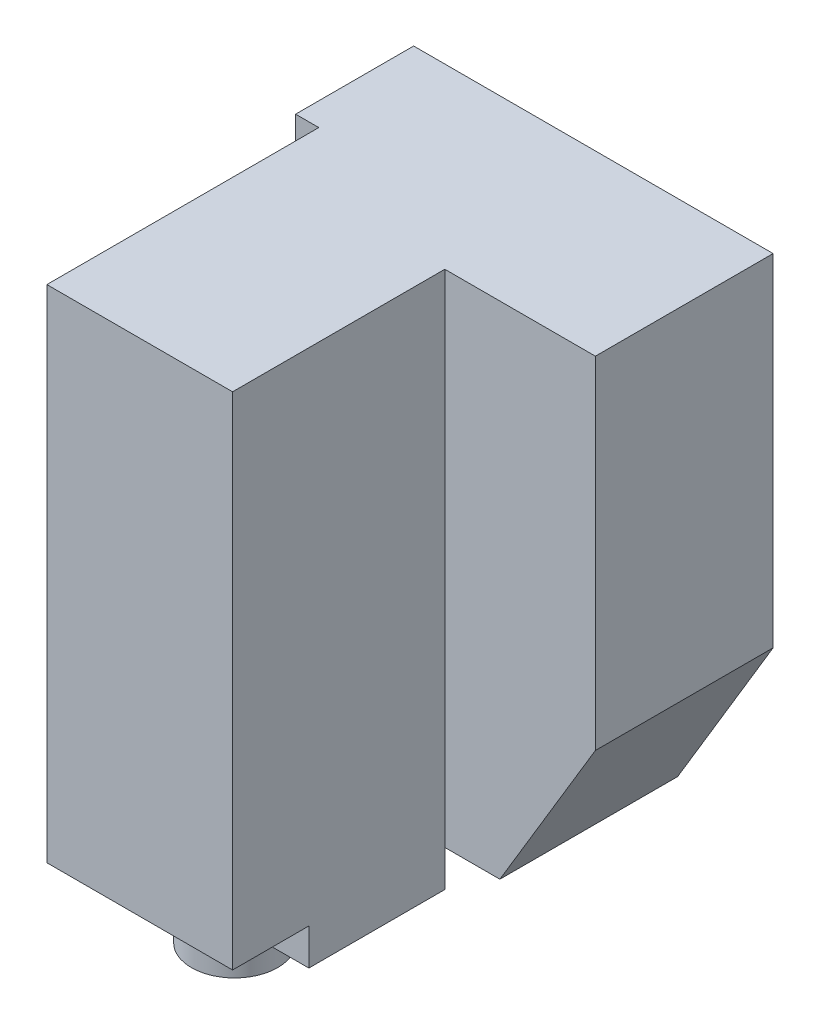
ISO-10303-21;
HEADER;
FILE_DESCRIPTION(('STEP AP214'),'2;1');
FILE_NAME('part.step','',(''),(''),'','','');
FILE_SCHEMA(('AUTOMOTIVE_DESIGN { 1 0 10303 214 1 1 1 1 }'));
ENDSEC;
DATA;
#1=APPLICATION_CONTEXT('core data for automotive mechanical design processes');
#2=APPLICATION_PROTOCOL_DEFINITION('international standard','automotive_design',2000,#1);
#3=PRODUCT_CONTEXT('',#1,'mechanical');
#4=PRODUCT('Part','Part','',(#3));
#5=PRODUCT_RELATED_PRODUCT_CATEGORY('part','',(#4));
#6=PRODUCT_DEFINITION_FORMATION('','',#4);
#7=PRODUCT_DEFINITION_CONTEXT('part definition',#1,'design');
#8=PRODUCT_DEFINITION('design','',#6,#7);
#9=PRODUCT_DEFINITION_SHAPE('','',#8);
#10=(LENGTH_UNIT() NAMED_UNIT(*) SI_UNIT(.MILLI.,.METRE.));
#11=(NAMED_UNIT(*) PLANE_ANGLE_UNIT() SI_UNIT($,.RADIAN.));
#12=(NAMED_UNIT(*) SI_UNIT($,.STERADIAN.) SOLID_ANGLE_UNIT());
#13=UNCERTAINTY_MEASURE_WITH_UNIT(LENGTH_MEASURE(1.E-05),#10,'distance_accuracy_value','');
#14=(GEOMETRIC_REPRESENTATION_CONTEXT(3) GLOBAL_UNCERTAINTY_ASSIGNED_CONTEXT((#13)) GLOBAL_UNIT_ASSIGNED_CONTEXT((#10,
#11,#12)) REPRESENTATION_CONTEXT('',''));
#15=CARTESIAN_POINT('',(0.,0.,0.));
#16=DIRECTION('',(0.,0.,1.));
#17=DIRECTION('',(1.,0.,0.));
#18=AXIS2_PLACEMENT_3D('',#15,#16,#17);
#19=CARTESIAN_POINT('',(-280.,0.,588.));
#20=DIRECTION('',(0.,1.,0.));
#21=DIRECTION('',(0.,0.,1.));
#22=AXIS2_PLACEMENT_3D('',#19,#20,#21);
#23=PLANE('',#22);
#24=CARTESIAN_POINT('',(-160.,0.,425.));
#25=DIRECTION('',(0.,1.,0.));
#26=DIRECTION('',(0.,0.,1.));
#27=AXIS2_PLACEMENT_3D('',#24,#25,#26);
#28=CIRCLE('',#27,81.);
#29=CARTESIAN_POINT('',(-160.,0.,506.));
#30=VERTEX_POINT('',#29);
#31=EDGE_CURVE('E45',#30,#30,#28,.F.);
#32=ORIENTED_EDGE('',*,*,#31,.F.);
#33=EDGE_LOOP('',(#32));
#34=FACE_BOUND('',#33,.T.);
#35=DIRECTION('',(1.,0.,0.));
#36=VECTOR('',#35,1.);
#37=CARTESIAN_POINT('',(-55.,0.,268.));
#38=LINE('',#37,#36);
#39=CARTESIAN_POINT('',(-55.,0.,268.));
#40=VERTEX_POINT('',#39);
#41=CARTESIAN_POINT('',(0.,0.,268.));
#42=VERTEX_POINT('',#41);
#43=EDGE_CURVE('E58',#40,#42,#38,.T.);
#44=ORIENTED_EDGE('',*,*,#43,.F.);
#45=DIRECTION('',(0.,0.,-1.));
#46=VECTOR('',#45,1.);
#47=CARTESIAN_POINT('',(-55.,0.,473.));
#48=LINE('',#47,#46);
#49=CARTESIAN_POINT('',(-55.,0.,473.));
#50=VERTEX_POINT('',#49);
#51=EDGE_CURVE('E169',#50,#40,#48,.T.);
#52=ORIENTED_EDGE('',*,*,#51,.F.);
#53=DIRECTION('',(-1.,0.,0.));
#54=VECTOR('',#53,1.);
#55=CARTESIAN_POINT('',(-55.,0.,473.));
#56=LINE('',#55,#54);
#57=CARTESIAN_POINT('',(0.,0.,473.));
#58=VERTEX_POINT('',#57);
#59=EDGE_CURVE('E64',#58,#50,#56,.T.);
#60=ORIENTED_EDGE('',*,*,#59,.F.);
#61=DIRECTION('',(0.,0.,-1.));
#62=VECTOR('',#61,1.);
#63=CARTESIAN_POINT('',(0.,0.,588.));
#64=LINE('',#63,#62);
#65=CARTESIAN_POINT('',(0.,0.,588.));
#66=VERTEX_POINT('',#65);
#67=EDGE_CURVE('E260',#66,#58,#64,.T.);
#68=ORIENTED_EDGE('',*,*,#67,.F.);
#69=DIRECTION('',(1.,0.,0.));
#70=VECTOR('',#69,1.);
#71=CARTESIAN_POINT('',(-280.,0.,588.));
#72=LINE('',#71,#70);
#73=CARTESIAN_POINT('',(-280.,0.,588.));
#74=VERTEX_POINT('',#73);
#75=EDGE_CURVE('E251',#74,#66,#72,.T.);
#76=ORIENTED_EDGE('',*,*,#75,.F.);
#77=DIRECTION('',(0.,0.,-1.));
#78=VECTOR('',#77,1.);
#79=CARTESIAN_POINT('',(-280.,0.,588.));
#80=LINE('',#79,#78);
#81=CARTESIAN_POINT('',(-280.,0.,178.));
#82=VERTEX_POINT('',#81);
#83=EDGE_CURVE('E262',#74,#82,#80,.T.);
#84=ORIENTED_EDGE('',*,*,#83,.T.);
#85=DIRECTION('',(1.,0.,0.));
#86=VECTOR('',#85,1.);
#87=CARTESIAN_POINT('',(0.,0.,178.));
#88=LINE('',#87,#86);
#89=CARTESIAN_POINT('',(0.,0.,178.));
#90=VERTEX_POINT('',#89);
#91=EDGE_CURVE('E170',#82,#90,#88,.T.);
#92=ORIENTED_EDGE('',*,*,#91,.T.);
#93=DIRECTION('',(0.,0.,1.));
#94=VECTOR('',#93,1.);
#95=CARTESIAN_POINT('',(0.,0.,-883.091161772102));
#96=LINE('',#95,#94);
#97=CARTESIAN_POINT('',(0.,0.,0.));
#98=VERTEX_POINT('',#97);
#99=EDGE_CURVE('E182',#98,#90,#96,.T.);
#100=ORIENTED_EDGE('',*,*,#99,.F.);
#101=DIRECTION('',(1.,0.,0.));
#102=VECTOR('',#101,1.);
#103=CARTESIAN_POINT('',(-280.,0.,0.));
#104=LINE('',#103,#102);
#105=CARTESIAN_POINT('',(83.,0.,0.));
#106=VERTEX_POINT('',#105);
#107=EDGE_CURVE('E249',#98,#106,#104,.T.);
#108=ORIENTED_EDGE('',*,*,#107,.T.);
#109=DIRECTION('',(0.,0.,1.));
#110=VECTOR('',#109,1.);
#111=CARTESIAN_POINT('',(83.,0.,-788.38696082571));
#112=LINE('',#111,#110);
#113=CARTESIAN_POINT('',(83.,0.,268.));
#114=VERTEX_POINT('',#113);
#115=EDGE_CURVE('E213',#106,#114,#112,.T.);
#116=ORIENTED_EDGE('',*,*,#115,.T.);
#117=DIRECTION('',(1.,0.,0.));
#118=VECTOR('',#117,1.);
#119=CARTESIAN_POINT('',(0.,0.,268.));
#120=LINE('',#119,#118);
#121=EDGE_CURVE('E224',#42,#114,#120,.T.);
#122=ORIENTED_EDGE('',*,*,#121,.F.);
#123=EDGE_LOOP('',(#44,#52,#60,#68,#76,#84,#92,#100,#108,#116,#122));
#124=FACE_BOUND('',#123,.T.);
#125=ADVANCED_FACE('F41',(#34,#124),#23,.F.);
#126=CARTESIAN_POINT('',(0.,0.,588.));
#127=DIRECTION('',(-1.,0.,0.));
#128=DIRECTION('',(0.,0.,1.));
#129=AXIS2_PLACEMENT_3D('',#126,#127,#128);
#130=PLANE('',#129);
#131=DIRECTION('',(0.,-1.,0.));
#132=VECTOR('',#131,1.);
#133=CARTESIAN_POINT('',(0.,755.,268.));
#134=LINE('',#133,#132);
#135=CARTESIAN_POINT('',(0.,755.,268.));
#136=VERTEX_POINT('',#135);
#137=EDGE_CURVE('E222',#136,#42,#134,.T.);
#138=ORIENTED_EDGE('',*,*,#137,.F.);
#139=DIRECTION('',(0.,0.,-1.));
#140=VECTOR('',#139,1.);
#141=CARTESIAN_POINT('',(0.,755.,588.));
#142=LINE('',#141,#140);
#143=CARTESIAN_POINT('',(0.,755.,588.));
#144=VERTEX_POINT('',#143);
#145=EDGE_CURVE('E255',#144,#136,#142,.T.);
#146=ORIENTED_EDGE('',*,*,#145,.F.);
#147=DIRECTION('',(0.,1.,0.));
#148=VECTOR('',#147,1.);
#149=CARTESIAN_POINT('',(0.,0.,588.));
#150=LINE('',#149,#148);
#151=EDGE_CURVE('E253',#66,#144,#150,.T.);
#152=ORIENTED_EDGE('',*,*,#151,.F.);
#153=ORIENTED_EDGE('',*,*,#67,.T.);
#154=DIRECTION('',(0.,1.,0.));
#155=VECTOR('',#154,1.);
#156=CARTESIAN_POINT('',(0.,-55.,473.));
#157=LINE('',#156,#155);
#158=CARTESIAN_POINT('',(0.,-55.,473.));
#159=VERTEX_POINT('',#158);
#160=EDGE_CURVE('E174',#159,#58,#157,.T.);
#161=ORIENTED_EDGE('',*,*,#160,.F.);
#162=DIRECTION('',(0.,0.,1.));
#163=VECTOR('',#162,1.);
#164=CARTESIAN_POINT('',(0.,-55.,473.));
#165=LINE('',#164,#163);
#166=CARTESIAN_POINT('',(0.,-55.,268.));
#167=VERTEX_POINT('',#166);
#168=EDGE_CURVE('E157',#167,#159,#165,.T.);
#169=ORIENTED_EDGE('',*,*,#168,.F.);
#170=DIRECTION('',(0.,1.,0.));
#171=VECTOR('',#170,1.);
#172=CARTESIAN_POINT('',(0.,-55.,268.));
#173=LINE('',#172,#171);
#174=EDGE_CURVE('E154',#167,#42,#173,.T.);
#175=ORIENTED_EDGE('',*,*,#174,.T.);
#176=EDGE_LOOP('',(#138,#146,#152,#153,#161,#169,#175));
#177=FACE_BOUND('',#176,.T.);
#178=ADVANCED_FACE('F273',(#177),#130,.F.);
#179=CARTESIAN_POINT('',(-280.,755.,588.));
#180=DIRECTION('',(0.,-1.,0.));
#181=DIRECTION('',(0.,0.,-1.));
#182=AXIS2_PLACEMENT_3D('',#179,#180,#181);
#183=PLANE('',#182);
#184=DIRECTION('',(-1.,0.,0.));
#185=VECTOR('',#184,1.);
#186=CARTESIAN_POINT('',(-280.,755.,0.));
#187=LINE('',#186,#185);
#188=CARTESIAN_POINT('',(227.,755.,0.));
#189=VERTEX_POINT('',#188);
#190=CARTESIAN_POINT('',(-315.,755.,0.));
#191=VERTEX_POINT('',#190);
#192=EDGE_CURVE('E244',#189,#191,#187,.T.);
#193=ORIENTED_EDGE('',*,*,#192,.T.);
#194=DIRECTION('',(0.,0.,1.));
#195=VECTOR('',#194,1.);
#196=CARTESIAN_POINT('',(-315.,755.,-883.091161772102));
#197=LINE('',#196,#195);
#198=CARTESIAN_POINT('',(-315.,755.,178.));
#199=VERTEX_POINT('',#198);
#200=EDGE_CURVE('E201',#191,#199,#197,.T.);
#201=ORIENTED_EDGE('',*,*,#200,.T.);
#202=DIRECTION('',(1.,0.,0.));
#203=VECTOR('',#202,1.);
#204=CARTESIAN_POINT('',(0.,755.,178.));
#205=LINE('',#204,#203);
#206=CARTESIAN_POINT('',(-280.,755.,178.));
#207=VERTEX_POINT('',#206);
#208=EDGE_CURVE('E189',#199,#207,#205,.T.);
#209=ORIENTED_EDGE('',*,*,#208,.T.);
#210=DIRECTION('',(0.,0.,-1.));
#211=VECTOR('',#210,1.);
#212=CARTESIAN_POINT('',(-280.,755.,588.));
#213=LINE('',#212,#211);
#214=CARTESIAN_POINT('',(-280.,755.,588.));
#215=VERTEX_POINT('',#214);
#216=EDGE_CURVE('E264',#215,#207,#213,.T.);
#217=ORIENTED_EDGE('',*,*,#216,.F.);
#218=DIRECTION('',(-1.,0.,0.));
#219=VECTOR('',#218,1.);
#220=CARTESIAN_POINT('',(-280.,755.,588.));
#221=LINE('',#220,#219);
#222=EDGE_CURVE('E245',#144,#215,#221,.T.);
#223=ORIENTED_EDGE('',*,*,#222,.F.);
#224=ORIENTED_EDGE('',*,*,#145,.T.);
#225=DIRECTION('',(-1.,0.,0.));
#226=VECTOR('',#225,1.);
#227=CARTESIAN_POINT('',(227.,755.,268.));
#228=LINE('',#227,#226);
#229=CARTESIAN_POINT('',(227.,755.,268.));
#230=VERTEX_POINT('',#229);
#231=EDGE_CURVE('E219',#230,#136,#228,.T.);
#232=ORIENTED_EDGE('',*,*,#231,.F.);
#233=DIRECTION('',(0.,0.,1.));
#234=VECTOR('',#233,1.);
#235=CARTESIAN_POINT('',(227.,755.,-788.38696082571));
#236=LINE('',#235,#234);
#237=EDGE_CURVE('E229',#189,#230,#236,.T.);
#238=ORIENTED_EDGE('',*,*,#237,.F.);
#239=EDGE_LOOP('',(#193,#201,#209,#217,#223,#224,#232,#238));
#240=FACE_BOUND('',#239,.T.);
#241=ADVANCED_FACE('F43',(#240),#183,.F.);
#242=CARTESIAN_POINT('',(-280.,755.,588.));
#243=DIRECTION('',(1.,0.,0.));
#244=DIRECTION('',(0.,1.,0.));
#245=AXIS2_PLACEMENT_3D('',#242,#243,#244);
#246=PLANE('',#245);
#247=ORIENTED_EDGE('',*,*,#216,.T.);
#248=DIRECTION('',(0.,-1.,0.));
#249=VECTOR('',#248,1.);
#250=CARTESIAN_POINT('',(-280.,0.,178.));
#251=LINE('',#250,#249);
#252=EDGE_CURVE('E172',#207,#82,#251,.T.);
#253=ORIENTED_EDGE('',*,*,#252,.T.);
#254=ORIENTED_EDGE('',*,*,#83,.F.);
#255=DIRECTION('',(0.,-1.,0.));
#256=VECTOR('',#255,1.);
#257=CARTESIAN_POINT('',(-280.,755.,588.));
#258=LINE('',#257,#256);
#259=EDGE_CURVE('E248',#215,#74,#258,.T.);
#260=ORIENTED_EDGE('',*,*,#259,.F.);
#261=EDGE_LOOP('',(#247,#253,#254,#260));
#262=FACE_BOUND('',#261,.T.);
#263=ADVANCED_FACE('F282',(#262),#246,.F.);
#264=CARTESIAN_POINT('',(0.,0.,588.));
#265=DIRECTION('',(0.,0.,1.));
#266=DIRECTION('',(1.,0.,0.));
#267=AXIS2_PLACEMENT_3D('',#264,#265,#266);
#268=PLANE('',#267);
#269=ORIENTED_EDGE('',*,*,#222,.T.);
#270=ORIENTED_EDGE('',*,*,#259,.T.);
#271=ORIENTED_EDGE('',*,*,#75,.T.);
#272=ORIENTED_EDGE('',*,*,#151,.T.);
#273=EDGE_LOOP('',(#269,#270,#271,#272));
#274=FACE_BOUND('',#273,.T.);
#275=ADVANCED_FACE('F284',(#274),#268,.T.);
#276=CARTESIAN_POINT('',(0.,0.,0.));
#277=DIRECTION('',(0.,0.,1.));
#278=DIRECTION('',(1.,0.,0.));
#279=AXIS2_PLACEMENT_3D('',#276,#277,#278);
#280=PLANE('',#279);
#281=ORIENTED_EDGE('',*,*,#192,.F.);
#282=DIRECTION('',(0.,-1.,0.));
#283=VECTOR('',#282,1.);
#284=CARTESIAN_POINT('',(227.,240.133296316858,0.));
#285=LINE('',#284,#283);
#286=CARTESIAN_POINT('',(227.,240.133296316858,0.));
#287=VERTEX_POINT('',#286);
#288=EDGE_CURVE('E212',#189,#287,#285,.T.);
#289=ORIENTED_EDGE('',*,*,#288,.T.);
#290=DIRECTION('',(-0.514285714285714,-0.857618915417351,0.));
#291=VECTOR('',#290,1.);
#292=CARTESIAN_POINT('',(83.,0.,0.));
#293=LINE('',#292,#291);
#294=EDGE_CURVE('E209',#287,#106,#293,.T.);
#295=ORIENTED_EDGE('',*,*,#294,.T.);
#296=ORIENTED_EDGE('',*,*,#107,.F.);
#297=DIRECTION('',(0.,1.,0.));
#298=VECTOR('',#297,1.);
#299=CARTESIAN_POINT('',(0.,0.,0.));
#300=LINE('',#299,#298);
#301=CARTESIAN_POINT('',(0.,-70.,0.));
#302=VERTEX_POINT('',#301);
#303=EDGE_CURVE('E184',#302,#98,#300,.T.);
#304=ORIENTED_EDGE('',*,*,#303,.F.);
#305=DIRECTION('',(-1.,0.,0.));
#306=VECTOR('',#305,1.);
#307=CARTESIAN_POINT('',(0.,-70.,0.));
#308=LINE('',#307,#306);
#309=CARTESIAN_POINT('',(-315.,-70.,0.));
#310=VERTEX_POINT('',#309);
#311=EDGE_CURVE('E181',#302,#310,#308,.T.);
#312=ORIENTED_EDGE('',*,*,#311,.T.);
#313=DIRECTION('',(0.,-1.,0.));
#314=VECTOR('',#313,1.);
#315=CARTESIAN_POINT('',(-315.,0.,0.));
#316=LINE('',#315,#314);
#317=EDGE_CURVE('E178',#191,#310,#316,.T.);
#318=ORIENTED_EDGE('',*,*,#317,.F.);
#319=EDGE_LOOP('',(#281,#289,#295,#296,#304,#312,#318));
#320=FACE_BOUND('',#319,.T.);
#321=ADVANCED_FACE('F290',(#320),#280,.F.);
#322=CARTESIAN_POINT('',(-160.,-20.,425.));
#323=DIRECTION('',(0.,1.,0.));
#324=DIRECTION('',(0.,0.,1.));
#325=AXIS2_PLACEMENT_3D('',#322,#323,#324);
#326=CYLINDRICAL_SURFACE('',#325,81.);
#327=CARTESIAN_POINT('',(-160.,-20.,425.));
#328=DIRECTION('',(0.,-1.,0.));
#329=DIRECTION('',(0.,0.,-1.));
#330=AXIS2_PLACEMENT_3D('',#327,#328,#329);
#331=CIRCLE('',#330,81.);
#332=CARTESIAN_POINT('',(-160.,-20.,344.));
#333=VERTEX_POINT('',#332);
#334=EDGE_CURVE('E239',#333,#333,#331,.T.);
#335=ORIENTED_EDGE('',*,*,#334,.F.);
#336=EDGE_LOOP('',(#335));
#337=FACE_BOUND('',#336,.T.);
#338=ORIENTED_EDGE('',*,*,#31,.T.);
#339=EDGE_LOOP('',(#338));
#340=FACE_BOUND('',#339,.T.);
#341=ADVANCED_FACE('F270',(#337,#340),#326,.T.);
#342=CARTESIAN_POINT('',(-160.,-20.,425.));
#343=DIRECTION('',(0.,-1.,0.));
#344=DIRECTION('',(0.,0.,-1.));
#345=AXIS2_PLACEMENT_3D('',#342,#343,#344);
#346=PLANE('',#345);
#347=CARTESIAN_POINT('',(-160.,-20.,425.));
#348=DIRECTION('',(0.,-1.,0.));
#349=DIRECTION('',(0.,0.,-1.));
#350=AXIS2_PLACEMENT_3D('',#347,#348,#349);
#351=CIRCLE('',#350,65.);
#352=CARTESIAN_POINT('',(-160.,-20.,360.));
#353=VERTEX_POINT('',#352);
#354=EDGE_CURVE('E50',#353,#353,#351,.T.);
#355=ORIENTED_EDGE('',*,*,#354,.F.);
#356=EDGE_LOOP('',(#355));
#357=FACE_BOUND('',#356,.T.);
#358=ORIENTED_EDGE('',*,*,#334,.T.);
#359=EDGE_LOOP('',(#358));
#360=FACE_BOUND('',#359,.T.);
#361=ADVANCED_FACE('F369',(#357,#360),#346,.T.);
#362=CARTESIAN_POINT('',(-160.,-126.,425.));
#363=DIRECTION('',(0.,1.,0.));
#364=DIRECTION('',(0.,0.,1.));
#365=AXIS2_PLACEMENT_3D('',#362,#363,#364);
#366=CYLINDRICAL_SURFACE('',#365,65.);
#367=CARTESIAN_POINT('',(-160.,-126.,425.));
#368=DIRECTION('',(0.,-1.,0.));
#369=DIRECTION('',(0.,0.,-1.));
#370=AXIS2_PLACEMENT_3D('',#367,#368,#369);
#371=CIRCLE('',#370,65.);
#372=CARTESIAN_POINT('',(-160.,-126.,360.));
#373=VERTEX_POINT('',#372);
#374=EDGE_CURVE('E235',#373,#373,#371,.T.);
#375=ORIENTED_EDGE('',*,*,#374,.F.);
#376=EDGE_LOOP('',(#375));
#377=FACE_BOUND('',#376,.T.);
#378=ORIENTED_EDGE('',*,*,#354,.T.);
#379=EDGE_LOOP('',(#378));
#380=FACE_BOUND('',#379,.T.);
#381=ADVANCED_FACE('F365',(#377,#380),#366,.T.);
#382=CARTESIAN_POINT('',(-160.,-126.,425.));
#383=DIRECTION('',(0.,-1.,0.));
#384=DIRECTION('',(0.,0.,-1.));
#385=AXIS2_PLACEMENT_3D('',#382,#383,#384);
#386=PLANE('',#385);
#387=CARTESIAN_POINT('',(-160.,-126.,425.));
#388=DIRECTION('',(0.,-1.,0.));
#389=DIRECTION('',(0.,0.,-1.));
#390=AXIS2_PLACEMENT_3D('',#387,#388,#389);
#391=CIRCLE('',#390,37.);
#392=CARTESIAN_POINT('',(-160.,-126.,462.));
#393=VERTEX_POINT('',#392);
#394=EDGE_CURVE('E11',#393,#393,#391,.T.);
#395=ORIENTED_EDGE('',*,*,#394,.F.);
#396=EDGE_LOOP('',(#395));
#397=FACE_BOUND('',#396,.T.);
#398=ORIENTED_EDGE('',*,*,#374,.T.);
#399=EDGE_LOOP('',(#398));
#400=FACE_BOUND('',#399,.T.);
#401=ADVANCED_FACE('F361',(#397,#400),#386,.T.);
#402=CARTESIAN_POINT('',(-160.,-139.,425.));
#403=DIRECTION('',(0.,1.,0.));
#404=DIRECTION('',(0.,0.,1.));
#405=AXIS2_PLACEMENT_3D('',#402,#403,#404);
#406=CYLINDRICAL_SURFACE('',#405,37.);
#407=CARTESIAN_POINT('',(-160.,-139.,425.));
#408=DIRECTION('',(0.,-1.,0.));
#409=DIRECTION('',(0.,0.,-1.));
#410=AXIS2_PLACEMENT_3D('',#407,#408,#409);
#411=CIRCLE('',#410,37.);
#412=CARTESIAN_POINT('',(-160.,-139.,462.));
#413=VERTEX_POINT('',#412);
#414=EDGE_CURVE('E233',#413,#413,#411,.T.);
#415=CARTESIAN_POINT('',(-160.,-139.,462.));
#416=CARTESIAN_POINT('',(-160.,-138.864583333333,462.));
#417=CARTESIAN_POINT('',(-160.,-138.729166666667,462.));
#418=CARTESIAN_POINT('',(-160.,-138.458333333333,462.));
#419=CARTESIAN_POINT('',(-160.,-138.322916666667,462.));
#420=CARTESIAN_POINT('',(-160.,-138.052083333333,462.));
#421=CARTESIAN_POINT('',(-160.,-137.916666666667,462.));
#422=CARTESIAN_POINT('',(-160.,-137.645833333333,462.));
#423=CARTESIAN_POINT('',(-160.,-137.510416666667,462.));
#424=CARTESIAN_POINT('',(-160.,-137.239583333333,462.));
#425=CARTESIAN_POINT('',(-160.,-137.104166666667,462.));
#426=CARTESIAN_POINT('',(-160.,-136.833333333333,462.));
#427=CARTESIAN_POINT('',(-160.,-136.697916666667,462.));
#428=CARTESIAN_POINT('',(-160.,-136.427083333333,462.));
#429=CARTESIAN_POINT('',(-160.,-136.291666666667,462.));
#430=CARTESIAN_POINT('',(-160.,-136.020833333333,462.));
#431=CARTESIAN_POINT('',(-160.,-135.885416666667,462.));
#432=CARTESIAN_POINT('',(-160.,-135.614583333333,462.));
#433=CARTESIAN_POINT('',(-160.,-135.479166666667,462.));
#434=CARTESIAN_POINT('',(-160.,-135.208333333333,462.));
#435=CARTESIAN_POINT('',(-160.,-135.072916666667,462.));
#436=CARTESIAN_POINT('',(-160.,-134.802083333333,462.));
#437=CARTESIAN_POINT('',(-160.,-134.666666666667,462.));
#438=CARTESIAN_POINT('',(-160.,-134.395833333333,462.));
#439=CARTESIAN_POINT('',(-160.,-134.260416666667,462.));
#440=CARTESIAN_POINT('',(-160.,-133.989583333333,462.));
#441=CARTESIAN_POINT('',(-160.,-133.854166666667,462.));
#442=CARTESIAN_POINT('',(-160.,-133.583333333333,462.));
#443=CARTESIAN_POINT('',(-160.,-133.447916666667,462.));
#444=CARTESIAN_POINT('',(-160.,-133.177083333333,462.));
#445=CARTESIAN_POINT('',(-160.,-133.041666666667,462.));
#446=CARTESIAN_POINT('',(-160.,-132.770833333333,462.));
#447=CARTESIAN_POINT('',(-160.,-132.635416666667,462.));
#448=CARTESIAN_POINT('',(-160.,-132.364583333333,462.));
#449=CARTESIAN_POINT('',(-160.,-132.229166666667,462.));
#450=CARTESIAN_POINT('',(-160.,-131.958333333333,462.));
#451=CARTESIAN_POINT('',(-160.,-131.822916666667,462.));
#452=CARTESIAN_POINT('',(-160.,-131.552083333333,462.));
#453=CARTESIAN_POINT('',(-160.,-131.416666666667,462.));
#454=CARTESIAN_POINT('',(-160.,-131.145833333333,462.));
#455=CARTESIAN_POINT('',(-160.,-131.010416666667,462.));
#456=CARTESIAN_POINT('',(-160.,-130.739583333333,462.));
#457=CARTESIAN_POINT('',(-160.,-130.604166666667,462.));
#458=CARTESIAN_POINT('',(-160.,-130.333333333333,462.));
#459=CARTESIAN_POINT('',(-160.,-130.197916666667,462.));
#460=CARTESIAN_POINT('',(-160.,-129.927083333333,462.));
#461=CARTESIAN_POINT('',(-160.,-129.791666666667,462.));
#462=CARTESIAN_POINT('',(-160.,-129.520833333333,462.));
#463=CARTESIAN_POINT('',(-160.,-129.385416666667,462.));
#464=CARTESIAN_POINT('',(-160.,-129.114583333333,462.));
#465=CARTESIAN_POINT('',(-160.,-128.979166666667,462.));
#466=CARTESIAN_POINT('',(-160.,-128.708333333333,462.));
#467=CARTESIAN_POINT('',(-160.,-128.572916666667,462.));
#468=CARTESIAN_POINT('',(-160.,-128.302083333333,462.));
#469=CARTESIAN_POINT('',(-160.,-128.166666666667,462.));
#470=CARTESIAN_POINT('',(-160.,-127.895833333333,462.));
#471=CARTESIAN_POINT('',(-160.,-127.760416666667,462.));
#472=CARTESIAN_POINT('',(-160.,-127.489583333333,462.));
#473=CARTESIAN_POINT('',(-160.,-127.354166666667,462.));
#474=CARTESIAN_POINT('',(-160.,-127.083333333333,462.));
#475=CARTESIAN_POINT('',(-160.,-126.947916666667,462.));
#476=CARTESIAN_POINT('',(-160.,-126.677083333333,462.));
#477=CARTESIAN_POINT('',(-160.,-126.541666666667,462.));
#478=CARTESIAN_POINT('',(-160.,-126.270833333333,462.));
#479=CARTESIAN_POINT('',(-160.,-126.135416666667,462.));
#480=CARTESIAN_POINT('',(-160.,-126.,462.));
#481=B_SPLINE_CURVE_WITH_KNOTS('',3,(#415,#416,#417,#418,#419,#420,#421,#422,#423,#424,#425,
#426,#427,#428,#429,#430,#431,#432,#433,#434,#435,#436,#437,#438,#439,#440,#441,#442,#443,#444,
#445,#446,#447,#448,#449,#450,#451,#452,#453,#454,#455,#456,#457,#458,#459,#460,#461,#462,#463,
#464,#465,#466,#467,#468,#469,#470,#471,#472,#473,#474,#475,#476,#477,#478,#479,#480),
.UNSPECIFIED.,.F.,.F.,(4,2,2,2,2,2,2,2,2,2,2,2,2,2,2,2,2,2,2,2,2,2,2,2,2,2,2,2,2,2,2,2,4),(0.,
0.406250000000025,0.812500000000022,1.21875000000002,1.62500000000002,2.03125000000001,
2.43750000000001,2.84375000000001,3.25000000000003,3.65625000000003,4.06250000000002,
4.46875000000002,4.87500000000002,5.28125000000002,5.68750000000001,6.09375000000001,
6.50000000000003,6.90625000000003,7.31250000000003,7.71875000000002,8.12500000000002,
8.53125000000002,8.93750000000001,9.34375000000001,9.75000000000004,10.15625,10.5625,10.96875,
11.375,11.78125,12.1875,12.59375,13.),.UNSPECIFIED.);
#482=EDGE_CURVE('BSEAM357',#413,#393,#481,.T.);
#483=ORIENTED_EDGE('',*,*,#414,.F.);
#484=ORIENTED_EDGE('',*,*,#394,.T.);
#485=ORIENTED_EDGE('',*,*,#482,.T.);
#486=ORIENTED_EDGE('',*,*,#482,.F.);
#487=EDGE_LOOP('',(#483,#485,#484,#486));
#488=FACE_BOUND('',#487,.T.);
#489=ADVANCED_FACE('F357',(#488),#406,.T.);
#490=CARTESIAN_POINT('',(-160.,-139.,425.));
#491=DIRECTION('',(0.,-1.,0.));
#492=DIRECTION('',(0.,0.,-1.));
#493=AXIS2_PLACEMENT_3D('',#490,#491,#492);
#494=PLANE('',#493);
#495=ORIENTED_EDGE('',*,*,#414,.T.);
#496=EDGE_LOOP('',(#495));
#497=FACE_BOUND('',#496,.T.);
#498=ADVANCED_FACE('F351',(#497),#494,.T.);
#499=CARTESIAN_POINT('',(83.,0.,-788.38696082571));
#500=DIRECTION('',(0.857618915417351,-0.514285714285714,0.));
#501=DIRECTION('',(0.514285714285714,0.857618915417351,0.));
#502=AXIS2_PLACEMENT_3D('',#499,#500,#501);
#503=PLANE('',#502);
#504=ORIENTED_EDGE('',*,*,#294,.F.);
#505=DIRECTION('',(0.,0.,1.));
#506=VECTOR('',#505,1.);
#507=CARTESIAN_POINT('',(227.,240.133296316858,-788.38696082571));
#508=LINE('',#507,#506);
#509=CARTESIAN_POINT('',(227.,240.133296316858,268.));
#510=VERTEX_POINT('',#509);
#511=EDGE_CURVE('E227',#287,#510,#508,.T.);
#512=ORIENTED_EDGE('',*,*,#511,.T.);
#513=DIRECTION('',(0.514285714285714,0.857618915417351,0.));
#514=VECTOR('',#513,1.);
#515=CARTESIAN_POINT('',(83.,0.,268.));
#516=LINE('',#515,#514);
#517=EDGE_CURVE('E186',#114,#510,#516,.T.);
#518=ORIENTED_EDGE('',*,*,#517,.F.);
#519=ORIENTED_EDGE('',*,*,#115,.F.);
#520=EDGE_LOOP('',(#504,#512,#518,#519));
#521=FACE_BOUND('',#520,.T.);
#522=ADVANCED_FACE('F341',(#521),#503,.T.);
#523=CARTESIAN_POINT('',(227.,240.133296316858,-788.38696082571));
#524=DIRECTION('',(1.,0.,0.));
#525=DIRECTION('',(0.,1.,0.));
#526=AXIS2_PLACEMENT_3D('',#523,#524,#525);
#527=PLANE('',#526);
#528=ORIENTED_EDGE('',*,*,#288,.F.);
#529=ORIENTED_EDGE('',*,*,#237,.T.);
#530=DIRECTION('',(0.,1.,0.));
#531=VECTOR('',#530,1.);
#532=CARTESIAN_POINT('',(227.,240.133296316858,268.));
#533=LINE('',#532,#531);
#534=EDGE_CURVE('E216',#510,#230,#533,.T.);
#535=ORIENTED_EDGE('',*,*,#534,.F.);
#536=ORIENTED_EDGE('',*,*,#511,.F.);
#537=EDGE_LOOP('',(#528,#529,#535,#536));
#538=FACE_BOUND('',#537,.T.);
#539=ADVANCED_FACE('F344',(#538),#527,.T.);
#540=CARTESIAN_POINT('',(0.,0.,268.));
#541=DIRECTION('',(0.,0.,1.));
#542=DIRECTION('',(1.,0.,0.));
#543=AXIS2_PLACEMENT_3D('',#540,#541,#542);
#544=PLANE('',#543);
#545=ORIENTED_EDGE('',*,*,#517,.T.);
#546=ORIENTED_EDGE('',*,*,#534,.T.);
#547=ORIENTED_EDGE('',*,*,#231,.T.);
#548=ORIENTED_EDGE('',*,*,#137,.T.);
#549=ORIENTED_EDGE('',*,*,#121,.T.);
#550=EDGE_LOOP('',(#545,#546,#547,#548,#549));
#551=FACE_BOUND('',#550,.T.);
#552=ADVANCED_FACE('F320',(#551),#544,.T.);
#553=CARTESIAN_POINT('',(0.,0.,178.));
#554=DIRECTION('',(0.,0.,1.));
#555=DIRECTION('',(1.,0.,0.));
#556=AXIS2_PLACEMENT_3D('',#553,#554,#555);
#557=PLANE('',#556);
#558=ORIENTED_EDGE('',*,*,#91,.F.);
#559=ORIENTED_EDGE('',*,*,#252,.F.);
#560=ORIENTED_EDGE('',*,*,#208,.F.);
#561=DIRECTION('',(0.,1.,0.));
#562=VECTOR('',#561,1.);
#563=CARTESIAN_POINT('',(-315.,0.,178.));
#564=LINE('',#563,#562);
#565=CARTESIAN_POINT('',(-315.,-70.,178.));
#566=VERTEX_POINT('',#565);
#567=EDGE_CURVE('E192',#566,#199,#564,.T.);
#568=ORIENTED_EDGE('',*,*,#567,.F.);
#569=DIRECTION('',(1.,0.,0.));
#570=VECTOR('',#569,1.);
#571=CARTESIAN_POINT('',(0.,-70.,178.));
#572=LINE('',#571,#570);
#573=CARTESIAN_POINT('',(0.,-70.,178.));
#574=VERTEX_POINT('',#573);
#575=EDGE_CURVE('E195',#566,#574,#572,.T.);
#576=ORIENTED_EDGE('',*,*,#575,.T.);
#577=DIRECTION('',(0.,-1.,0.));
#578=VECTOR('',#577,1.);
#579=CARTESIAN_POINT('',(0.,0.,178.));
#580=LINE('',#579,#578);
#581=EDGE_CURVE('E198',#90,#574,#580,.T.);
#582=ORIENTED_EDGE('',*,*,#581,.F.);
#583=EDGE_LOOP('',(#558,#559,#560,#568,#576,#582));
#584=FACE_BOUND('',#583,.T.);
#585=ADVANCED_FACE('F313',(#584),#557,.T.);
#586=CARTESIAN_POINT('',(-315.,0.,-883.091161772102));
#587=DIRECTION('',(1.,0.,0.));
#588=DIRECTION('',(0.,0.,-1.));
#589=AXIS2_PLACEMENT_3D('',#586,#587,#588);
#590=PLANE('',#589);
#591=ORIENTED_EDGE('',*,*,#200,.F.);
#592=ORIENTED_EDGE('',*,*,#317,.T.);
#593=DIRECTION('',(0.,0.,1.));
#594=VECTOR('',#593,1.);
#595=CARTESIAN_POINT('',(-315.,-70.,-883.091161772102));
#596=LINE('',#595,#594);
#597=EDGE_CURVE('E206',#310,#566,#596,.T.);
#598=ORIENTED_EDGE('',*,*,#597,.T.);
#599=ORIENTED_EDGE('',*,*,#567,.T.);
#600=EDGE_LOOP('',(#591,#592,#598,#599));
#601=FACE_BOUND('',#600,.T.);
#602=ADVANCED_FACE('F306',(#601),#590,.F.);
#603=CARTESIAN_POINT('',(0.,-70.,-883.091161772102));
#604=DIRECTION('',(0.,-1.,0.));
#605=DIRECTION('',(0.,0.,-1.));
#606=AXIS2_PLACEMENT_3D('',#603,#604,#605);
#607=PLANE('',#606);
#608=ORIENTED_EDGE('',*,*,#311,.F.);
#609=DIRECTION('',(0.,0.,1.));
#610=VECTOR('',#609,1.);
#611=CARTESIAN_POINT('',(0.,-70.,-883.091161772102));
#612=LINE('',#611,#610);
#613=EDGE_CURVE('E204',#302,#574,#612,.T.);
#614=ORIENTED_EDGE('',*,*,#613,.T.);
#615=ORIENTED_EDGE('',*,*,#575,.F.);
#616=ORIENTED_EDGE('',*,*,#597,.F.);
#617=EDGE_LOOP('',(#608,#614,#615,#616));
#618=FACE_BOUND('',#617,.T.);
#619=ADVANCED_FACE('F392',(#618),#607,.T.);
#620=CARTESIAN_POINT('',(0.,0.,-883.091161772102));
#621=DIRECTION('',(-1.,0.,0.));
#622=DIRECTION('',(0.,0.,1.));
#623=AXIS2_PLACEMENT_3D('',#620,#621,#622);
#624=PLANE('',#623);
#625=ORIENTED_EDGE('',*,*,#613,.F.);
#626=ORIENTED_EDGE('',*,*,#303,.T.);
#627=ORIENTED_EDGE('',*,*,#99,.T.);
#628=ORIENTED_EDGE('',*,*,#581,.T.);
#629=EDGE_LOOP('',(#625,#626,#627,#628));
#630=FACE_BOUND('',#629,.T.);
#631=ADVANCED_FACE('F337',(#630),#624,.F.);
#632=CARTESIAN_POINT('',(-55.,-55.,473.));
#633=DIRECTION('',(1.,0.,0.));
#634=DIRECTION('',(0.,0.,-1.));
#635=AXIS2_PLACEMENT_3D('',#632,#633,#634);
#636=PLANE('',#635);
#637=ORIENTED_EDGE('',*,*,#51,.T.);
#638=DIRECTION('',(0.,1.,0.));
#639=VECTOR('',#638,1.);
#640=CARTESIAN_POINT('',(-55.,-55.,268.));
#641=LINE('',#640,#639);
#642=CARTESIAN_POINT('',(-55.,-55.,268.));
#643=VERTEX_POINT('',#642);
#644=EDGE_CURVE('E151',#643,#40,#641,.T.);
#645=ORIENTED_EDGE('',*,*,#644,.F.);
#646=DIRECTION('',(0.,0.,-1.));
#647=VECTOR('',#646,1.);
#648=CARTESIAN_POINT('',(-55.,-55.,473.));
#649=LINE('',#648,#647);
#650=CARTESIAN_POINT('',(-55.,-55.,473.));
#651=VERTEX_POINT('',#650);
#652=EDGE_CURVE('E158',#651,#643,#649,.T.);
#653=ORIENTED_EDGE('',*,*,#652,.F.);
#654=DIRECTION('',(0.,1.,0.));
#655=VECTOR('',#654,1.);
#656=CARTESIAN_POINT('',(-55.,-55.,473.));
#657=LINE('',#656,#655);
#658=EDGE_CURVE('E328',#651,#50,#657,.T.);
#659=ORIENTED_EDGE('',*,*,#658,.T.);
#660=EDGE_LOOP('',(#637,#645,#653,#659));
#661=FACE_BOUND('',#660,.T.);
#662=ADVANCED_FACE('F168',(#661),#636,.F.);
#663=CARTESIAN_POINT('',(-55.,-55.,268.));
#664=DIRECTION('',(0.,0.,1.));
#665=DIRECTION('',(1.,0.,0.));
#666=AXIS2_PLACEMENT_3D('',#663,#664,#665);
#667=PLANE('',#666);
#668=ORIENTED_EDGE('',*,*,#43,.T.);
#669=ORIENTED_EDGE('',*,*,#174,.F.);
#670=DIRECTION('',(1.,0.,0.));
#671=VECTOR('',#670,1.);
#672=CARTESIAN_POINT('',(-55.,-55.,268.));
#673=LINE('',#672,#671);
#674=EDGE_CURVE('E147',#643,#167,#673,.T.);
#675=ORIENTED_EDGE('',*,*,#674,.F.);
#676=ORIENTED_EDGE('',*,*,#644,.T.);
#677=EDGE_LOOP('',(#668,#669,#675,#676));
#678=FACE_BOUND('',#677,.T.);
#679=ADVANCED_FACE('F149',(#678),#667,.F.);
#680=CARTESIAN_POINT('',(-55.,-55.,473.));
#681=DIRECTION('',(0.,0.,-1.));
#682=DIRECTION('',(-1.,0.,0.));
#683=AXIS2_PLACEMENT_3D('',#680,#681,#682);
#684=PLANE('',#683);
#685=ORIENTED_EDGE('',*,*,#59,.T.);
#686=ORIENTED_EDGE('',*,*,#658,.F.);
#687=DIRECTION('',(-1.,0.,0.));
#688=VECTOR('',#687,1.);
#689=CARTESIAN_POINT('',(-55.,-55.,473.));
#690=LINE('',#689,#688);
#691=EDGE_CURVE('E163',#159,#651,#690,.T.);
#692=ORIENTED_EDGE('',*,*,#691,.F.);
#693=ORIENTED_EDGE('',*,*,#160,.T.);
#694=EDGE_LOOP('',(#685,#686,#692,#693));
#695=FACE_BOUND('',#694,.T.);
#696=ADVANCED_FACE('F332',(#695),#684,.F.);
#697=CARTESIAN_POINT('',(0.,-55.,0.));
#698=DIRECTION('',(0.,-1.,0.));
#699=DIRECTION('',(0.,0.,-1.));
#700=AXIS2_PLACEMENT_3D('',#697,#698,#699);
#701=PLANE('',#700);
#702=ORIENTED_EDGE('',*,*,#652,.T.);
#703=ORIENTED_EDGE('',*,*,#674,.T.);
#704=ORIENTED_EDGE('',*,*,#168,.T.);
#705=ORIENTED_EDGE('',*,*,#691,.T.);
#706=EDGE_LOOP('',(#702,#703,#704,#705));
#707=FACE_BOUND('',#706,.T.);
#708=ADVANCED_FACE('F161',(#707),#701,.T.);
#709=CLOSED_SHELL('',(#125,#178,#241,#263,#275,#321,#341,#361,#381,#401,#489,#498,#522,#539,
#552,#585,#602,#619,#631,#662,#679,#696,#708));
#710=MANIFOLD_SOLID_BREP('B2',#709);
#711=ADVANCED_BREP_SHAPE_REPRESENTATION('',(#18,#710),#14);
#712=SHAPE_DEFINITION_REPRESENTATION(#9,#711);
ENDSEC;
END-ISO-10303-21;
